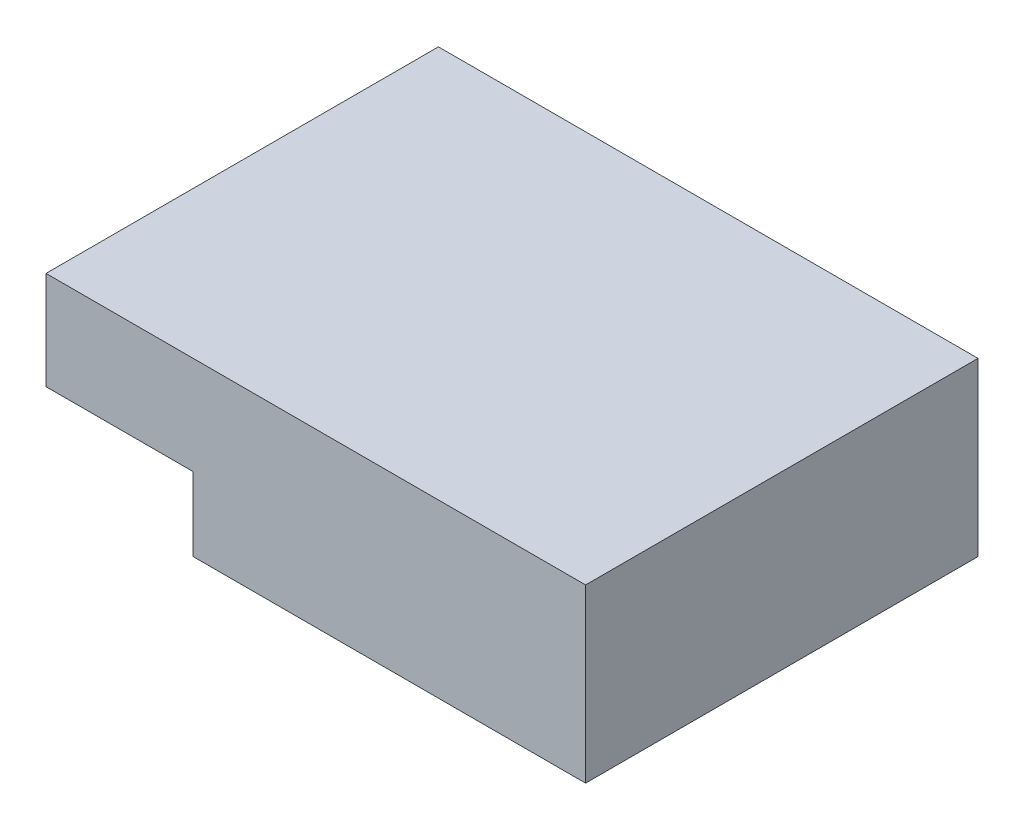
ISO-10303-21;
HEADER;
FILE_DESCRIPTION(('STEP AP214'),'2;1');
FILE_NAME('part.step','',(''),(''),'','','');
FILE_SCHEMA(('AUTOMOTIVE_DESIGN { 1 0 10303 214 1 1 1 1 }'));
ENDSEC;
DATA;
#1=APPLICATION_CONTEXT('core data for automotive mechanical design processes');
#2=APPLICATION_PROTOCOL_DEFINITION('international standard','automotive_design',2000,#1);
#3=PRODUCT_CONTEXT('',#1,'mechanical');
#4=PRODUCT('Part','Part','',(#3));
#5=PRODUCT_RELATED_PRODUCT_CATEGORY('part','',(#4));
#6=PRODUCT_DEFINITION_FORMATION('','',#4);
#7=PRODUCT_DEFINITION_CONTEXT('part definition',#1,'design');
#8=PRODUCT_DEFINITION('design','',#6,#7);
#9=PRODUCT_DEFINITION_SHAPE('','',#8);
#10=(LENGTH_UNIT() NAMED_UNIT(*) SI_UNIT(.MILLI.,.METRE.));
#11=(NAMED_UNIT(*) PLANE_ANGLE_UNIT() SI_UNIT($,.RADIAN.));
#12=(NAMED_UNIT(*) SI_UNIT($,.STERADIAN.) SOLID_ANGLE_UNIT());
#13=UNCERTAINTY_MEASURE_WITH_UNIT(LENGTH_MEASURE(1.E-05),#10,'distance_accuracy_value','');
#14=(GEOMETRIC_REPRESENTATION_CONTEXT(3) GLOBAL_UNCERTAINTY_ASSIGNED_CONTEXT((#13)) GLOBAL_UNIT_ASSIGNED_CONTEXT((#10,
#11,#12)) REPRESENTATION_CONTEXT('',''));
#15=CARTESIAN_POINT('',(0.,0.,0.));
#16=DIRECTION('',(0.,0.,1.));
#17=DIRECTION('',(1.,0.,0.));
#18=AXIS2_PLACEMENT_3D('',#15,#16,#17);
#19=CARTESIAN_POINT('',(8.,0.,4.));
#20=DIRECTION('',(0.,1.,0.));
#21=DIRECTION('',(-1.,0.,0.));
#22=AXIS2_PLACEMENT_3D('',#19,#20,#21);
#23=PLANE('',#22);
#24=DIRECTION('',(1.,0.,0.));
#25=VECTOR('',#24,1.);
#26=CARTESIAN_POINT('',(8.,0.,-4.));
#27=LINE('',#26,#25);
#28=CARTESIAN_POINT('',(0.,0.,-4.));
#29=VERTEX_POINT('',#28);
#30=CARTESIAN_POINT('',(8.,0.,-4.));
#31=VERTEX_POINT('',#30);
#32=EDGE_CURVE('E123',#29,#31,#27,.T.);
#33=ORIENTED_EDGE('',*,*,#32,.T.);
#34=DIRECTION('',(0.,0.,-1.));
#35=VECTOR('',#34,1.);
#36=CARTESIAN_POINT('',(8.,0.,4.));
#37=LINE('',#36,#35);
#38=CARTESIAN_POINT('',(8.,0.,4.));
#39=VERTEX_POINT('',#38);
#40=EDGE_CURVE('E11',#39,#31,#37,.T.);
#41=ORIENTED_EDGE('',*,*,#40,.F.);
#42=DIRECTION('',(1.,0.,0.));
#43=VECTOR('',#42,1.);
#44=CARTESIAN_POINT('',(8.,0.,4.));
#45=LINE('',#44,#43);
#46=CARTESIAN_POINT('',(0.,0.,4.));
#47=VERTEX_POINT('',#46);
#48=EDGE_CURVE('E133',#47,#39,#45,.T.);
#49=ORIENTED_EDGE('',*,*,#48,.F.);
#50=DIRECTION('',(0.,0.,-1.));
#51=VECTOR('',#50,1.);
#52=CARTESIAN_POINT('',(0.,0.,4.));
#53=LINE('',#52,#51);
#54=EDGE_CURVE('E119',#47,#29,#53,.T.);
#55=ORIENTED_EDGE('',*,*,#54,.T.);
#56=EDGE_LOOP('',(#33,#41,#49,#55));
#57=FACE_BOUND('',#56,.T.);
#58=ADVANCED_FACE('F39',(#57),#23,.F.);
#59=CARTESIAN_POINT('',(8.,3.5,4.));
#60=DIRECTION('',(-1.,0.,0.));
#61=DIRECTION('',(0.,0.,1.));
#62=AXIS2_PLACEMENT_3D('',#59,#60,#61);
#63=PLANE('',#62);
#64=DIRECTION('',(0.,1.,0.));
#65=VECTOR('',#64,1.);
#66=CARTESIAN_POINT('',(8.,3.5,-4.));
#67=LINE('',#66,#65);
#68=CARTESIAN_POINT('',(8.,3.5,-4.));
#69=VERTEX_POINT('',#68);
#70=EDGE_CURVE('E126',#31,#69,#67,.T.);
#71=ORIENTED_EDGE('',*,*,#70,.T.);
#72=DIRECTION('',(0.,0.,-1.));
#73=VECTOR('',#72,1.);
#74=CARTESIAN_POINT('',(8.,3.5,4.));
#75=LINE('',#74,#73);
#76=CARTESIAN_POINT('',(8.,3.5,4.));
#77=VERTEX_POINT('',#76);
#78=EDGE_CURVE('E47',#77,#69,#75,.T.);
#79=ORIENTED_EDGE('',*,*,#78,.F.);
#80=DIRECTION('',(0.,1.,0.));
#81=VECTOR('',#80,1.);
#82=CARTESIAN_POINT('',(8.,3.5,4.));
#83=LINE('',#82,#81);
#84=EDGE_CURVE('E92',#39,#77,#83,.T.);
#85=ORIENTED_EDGE('',*,*,#84,.F.);
#86=ORIENTED_EDGE('',*,*,#40,.T.);
#87=EDGE_LOOP('',(#71,#79,#85,#86));
#88=FACE_BOUND('',#87,.T.);
#89=ADVANCED_FACE('F157',(#88),#63,.F.);
#90=CARTESIAN_POINT('',(-3.,3.5,4.));
#91=DIRECTION('',(0.,-1.,0.));
#92=DIRECTION('',(0.,0.,-1.));
#93=AXIS2_PLACEMENT_3D('',#90,#91,#92);
#94=PLANE('',#93);
#95=DIRECTION('',(-1.,0.,0.));
#96=VECTOR('',#95,1.);
#97=CARTESIAN_POINT('',(-3.,3.5,-4.));
#98=LINE('',#97,#96);
#99=CARTESIAN_POINT('',(-3.,3.5,-4.));
#100=VERTEX_POINT('',#99);
#101=EDGE_CURVE('E128',#69,#100,#98,.T.);
#102=ORIENTED_EDGE('',*,*,#101,.T.);
#103=DIRECTION('',(0.,0.,-1.));
#104=VECTOR('',#103,1.);
#105=CARTESIAN_POINT('',(-3.,3.5,4.));
#106=LINE('',#105,#104);
#107=CARTESIAN_POINT('',(-3.,3.5,4.));
#108=VERTEX_POINT('',#107);
#109=EDGE_CURVE('E114',#108,#100,#106,.T.);
#110=ORIENTED_EDGE('',*,*,#109,.F.);
#111=DIRECTION('',(-1.,0.,0.));
#112=VECTOR('',#111,1.);
#113=CARTESIAN_POINT('',(-3.,3.5,4.));
#114=LINE('',#113,#112);
#115=EDGE_CURVE('E105',#77,#108,#114,.T.);
#116=ORIENTED_EDGE('',*,*,#115,.F.);
#117=ORIENTED_EDGE('',*,*,#78,.T.);
#118=EDGE_LOOP('',(#102,#110,#116,#117));
#119=FACE_BOUND('',#118,.T.);
#120=ADVANCED_FACE('F139',(#119),#94,.F.);
#121=CARTESIAN_POINT('',(-3.,1.5,4.));
#122=DIRECTION('',(1.,0.,0.));
#123=DIRECTION('',(0.,0.,-1.));
#124=AXIS2_PLACEMENT_3D('',#121,#122,#123);
#125=PLANE('',#124);
#126=DIRECTION('',(0.,-1.,0.));
#127=VECTOR('',#126,1.);
#128=CARTESIAN_POINT('',(-3.,1.5,-4.));
#129=LINE('',#128,#127);
#130=CARTESIAN_POINT('',(-3.,1.5,-4.));
#131=VERTEX_POINT('',#130);
#132=EDGE_CURVE('E113',#100,#131,#129,.T.);
#133=ORIENTED_EDGE('',*,*,#132,.T.);
#134=DIRECTION('',(0.,0.,-1.));
#135=VECTOR('',#134,1.);
#136=CARTESIAN_POINT('',(-3.,1.5,4.));
#137=LINE('',#136,#135);
#138=CARTESIAN_POINT('',(-3.,1.5,4.));
#139=VERTEX_POINT('',#138);
#140=EDGE_CURVE('E110',#139,#131,#137,.T.);
#141=ORIENTED_EDGE('',*,*,#140,.F.);
#142=DIRECTION('',(0.,-1.,0.));
#143=VECTOR('',#142,1.);
#144=CARTESIAN_POINT('',(-3.,1.5,4.));
#145=LINE('',#144,#143);
#146=EDGE_CURVE('E99',#108,#139,#145,.T.);
#147=ORIENTED_EDGE('',*,*,#146,.F.);
#148=ORIENTED_EDGE('',*,*,#109,.T.);
#149=EDGE_LOOP('',(#133,#141,#147,#148));
#150=FACE_BOUND('',#149,.T.);
#151=ADVANCED_FACE('F111',(#150),#125,.F.);
#152=CARTESIAN_POINT('',(0.,1.5,4.));
#153=DIRECTION('',(0.,1.,0.));
#154=DIRECTION('',(-1.,0.,0.));
#155=AXIS2_PLACEMENT_3D('',#152,#153,#154);
#156=PLANE('',#155);
#157=DIRECTION('',(1.,0.,0.));
#158=VECTOR('',#157,1.);
#159=CARTESIAN_POINT('',(0.,1.5,-4.));
#160=LINE('',#159,#158);
#161=CARTESIAN_POINT('',(0.,1.5,-4.));
#162=VERTEX_POINT('',#161);
#163=EDGE_CURVE('E78',#131,#162,#160,.T.);
#164=ORIENTED_EDGE('',*,*,#163,.T.);
#165=DIRECTION('',(0.,0.,-1.));
#166=VECTOR('',#165,1.);
#167=CARTESIAN_POINT('',(0.,1.5,4.));
#168=LINE('',#167,#166);
#169=CARTESIAN_POINT('',(0.,1.5,4.));
#170=VERTEX_POINT('',#169);
#171=EDGE_CURVE('E115',#170,#162,#168,.T.);
#172=ORIENTED_EDGE('',*,*,#171,.F.);
#173=DIRECTION('',(1.,0.,0.));
#174=VECTOR('',#173,1.);
#175=CARTESIAN_POINT('',(0.,1.5,4.));
#176=LINE('',#175,#174);
#177=EDGE_CURVE('E103',#139,#170,#176,.T.);
#178=ORIENTED_EDGE('',*,*,#177,.F.);
#179=ORIENTED_EDGE('',*,*,#140,.T.);
#180=EDGE_LOOP('',(#164,#172,#178,#179));
#181=FACE_BOUND('',#180,.T.);
#182=ADVANCED_FACE('F117',(#181),#156,.F.);
#183=CARTESIAN_POINT('',(0.,0.,4.));
#184=DIRECTION('',(1.,0.,0.));
#185=DIRECTION('',(0.,0.,-1.));
#186=AXIS2_PLACEMENT_3D('',#183,#184,#185);
#187=PLANE('',#186);
#188=DIRECTION('',(0.,-1.,0.));
#189=VECTOR('',#188,1.);
#190=CARTESIAN_POINT('',(0.,0.,-4.));
#191=LINE('',#190,#189);
#192=EDGE_CURVE('E84',#162,#29,#191,.T.);
#193=ORIENTED_EDGE('',*,*,#192,.T.);
#194=ORIENTED_EDGE('',*,*,#54,.F.);
#195=DIRECTION('',(0.,-1.,0.));
#196=VECTOR('',#195,1.);
#197=CARTESIAN_POINT('',(0.,0.,4.));
#198=LINE('',#197,#196);
#199=EDGE_CURVE('E55',#170,#47,#198,.T.);
#200=ORIENTED_EDGE('',*,*,#199,.F.);
#201=ORIENTED_EDGE('',*,*,#171,.T.);
#202=EDGE_LOOP('',(#193,#194,#200,#201));
#203=FACE_BOUND('',#202,.T.);
#204=ADVANCED_FACE('F146',(#203),#187,.F.);
#205=CARTESIAN_POINT('',(0.,0.,4.));
#206=DIRECTION('',(0.,0.,-1.));
#207=DIRECTION('',(-1.,0.,0.));
#208=AXIS2_PLACEMENT_3D('',#205,#206,#207);
#209=PLANE('',#208);
#210=ORIENTED_EDGE('',*,*,#48,.T.);
#211=ORIENTED_EDGE('',*,*,#84,.T.);
#212=ORIENTED_EDGE('',*,*,#115,.T.);
#213=ORIENTED_EDGE('',*,*,#146,.T.);
#214=ORIENTED_EDGE('',*,*,#177,.T.);
#215=ORIENTED_EDGE('',*,*,#199,.T.);
#216=EDGE_LOOP('',(#210,#211,#212,#213,#214,#215));
#217=FACE_BOUND('',#216,.T.);
#218=ADVANCED_FACE('F101',(#217),#209,.F.);
#219=CARTESIAN_POINT('',(0.,0.,-4.));
#220=DIRECTION('',(0.,0.,-1.));
#221=DIRECTION('',(-1.,0.,0.));
#222=AXIS2_PLACEMENT_3D('',#219,#220,#221);
#223=PLANE('',#222);
#224=ORIENTED_EDGE('',*,*,#32,.F.);
#225=ORIENTED_EDGE('',*,*,#192,.F.);
#226=ORIENTED_EDGE('',*,*,#163,.F.);
#227=ORIENTED_EDGE('',*,*,#132,.F.);
#228=ORIENTED_EDGE('',*,*,#101,.F.);
#229=ORIENTED_EDGE('',*,*,#70,.F.);
#230=EDGE_LOOP('',(#224,#225,#226,#227,#228,#229));
#231=FACE_BOUND('',#230,.T.);
#232=ADVANCED_FACE('F142',(#231),#223,.T.);
#233=CLOSED_SHELL('',(#58,#89,#120,#151,#182,#204,#218,#232));
#234=MANIFOLD_SOLID_BREP('B2',#233);
#235=ADVANCED_BREP_SHAPE_REPRESENTATION('',(#18,#234),#14);
#236=SHAPE_DEFINITION_REPRESENTATION(#9,#235);
ENDSEC;
END-ISO-10303-21;
